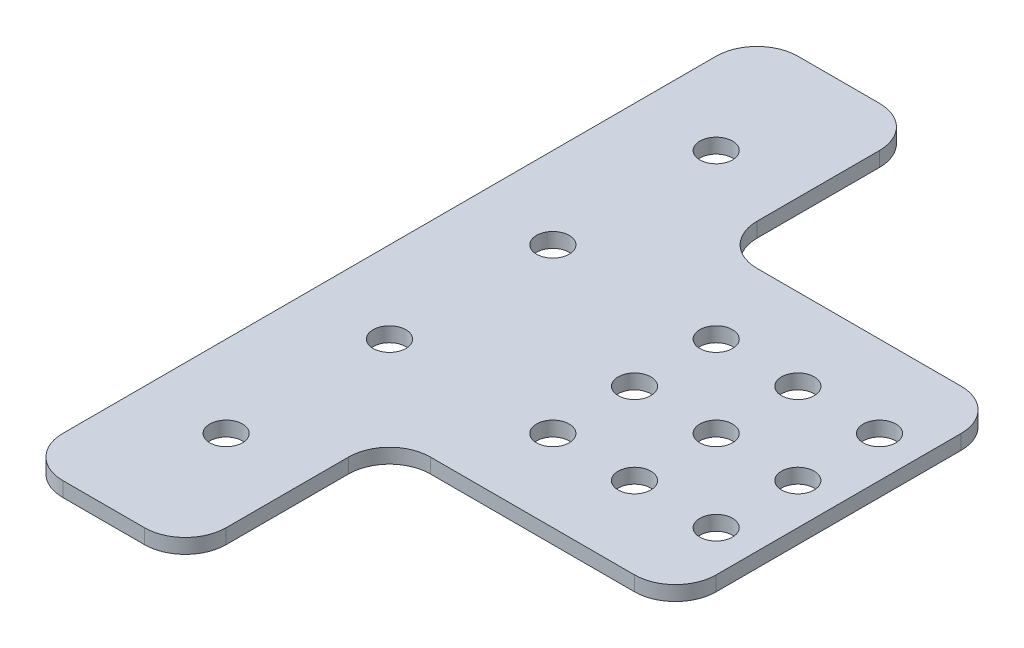
ISO-10303-21;
HEADER;
FILE_DESCRIPTION(('STEP AP214'),'2;1');
FILE_NAME('part.step','',(''),(''),'','','');
FILE_SCHEMA(('AUTOMOTIVE_DESIGN { 1 0 10303 214 1 1 1 1 }'));
ENDSEC;
DATA;
#1=APPLICATION_CONTEXT('core data for automotive mechanical design processes');
#2=APPLICATION_PROTOCOL_DEFINITION('international standard','automotive_design',2000,#1);
#3=PRODUCT_CONTEXT('',#1,'mechanical');
#4=PRODUCT('Part','Part','',(#3));
#5=PRODUCT_RELATED_PRODUCT_CATEGORY('part','',(#4));
#6=PRODUCT_DEFINITION_FORMATION('','',#4);
#7=PRODUCT_DEFINITION_CONTEXT('part definition',#1,'design');
#8=PRODUCT_DEFINITION('design','',#6,#7);
#9=PRODUCT_DEFINITION_SHAPE('','',#8);
#10=(LENGTH_UNIT() NAMED_UNIT(*) SI_UNIT(.MILLI.,.METRE.));
#11=(NAMED_UNIT(*) PLANE_ANGLE_UNIT() SI_UNIT($,.RADIAN.));
#12=(NAMED_UNIT(*) SI_UNIT($,.STERADIAN.) SOLID_ANGLE_UNIT());
#13=UNCERTAINTY_MEASURE_WITH_UNIT(LENGTH_MEASURE(1.E-05),#10,'distance_accuracy_value','');
#14=(GEOMETRIC_REPRESENTATION_CONTEXT(3) GLOBAL_UNCERTAINTY_ASSIGNED_CONTEXT((#13)) GLOBAL_UNIT_ASSIGNED_CONTEXT((#10,
#11,#12)) REPRESENTATION_CONTEXT('',''));
#15=CARTESIAN_POINT('',(0.,0.,0.));
#16=DIRECTION('',(0.,0.,1.));
#17=DIRECTION('',(1.,0.,0.));
#18=AXIS2_PLACEMENT_3D('',#15,#16,#17);
#19=CARTESIAN_POINT('',(0.,2.286,0.));
#20=DIRECTION('',(0.,1.,0.));
#21=DIRECTION('',(0.,0.,1.));
#22=AXIS2_PLACEMENT_3D('',#19,#20,#21);
#23=PLANE('',#22);
#24=CARTESIAN_POINT('',(38.1000000000001,2.286,-57.15));
#25=DIRECTION('',(0.,1.,0.));
#26=DIRECTION('',(0.,0.,1.));
#27=AXIS2_PLACEMENT_3D('',#24,#25,#26);
#28=CIRCLE('',#27,2.53999999999999);
#29=CARTESIAN_POINT('',(38.1000000000001,2.286,-54.61));
#30=VERTEX_POINT('',#29);
#31=EDGE_CURVE('E349',#30,#30,#28,.T.);
#32=ORIENTED_EDGE('',*,*,#31,.F.);
#33=EDGE_LOOP('',(#32));
#34=FACE_BOUND('',#33,.T.);
#35=CARTESIAN_POINT('',(50.8000000000002,2.286,-44.45));
#36=DIRECTION('',(0.,1.,0.));
#37=DIRECTION('',(0.,0.,1.));
#38=AXIS2_PLACEMENT_3D('',#35,#36,#37);
#39=CIRCLE('',#38,2.54);
#40=CARTESIAN_POINT('',(50.8000000000002,2.286,-41.91));
#41=VERTEX_POINT('',#40);
#42=EDGE_CURVE('E337',#41,#41,#39,.T.);
#43=ORIENTED_EDGE('',*,*,#42,.F.);
#44=EDGE_LOOP('',(#43));
#45=FACE_BOUND('',#44,.T.);
#46=CARTESIAN_POINT('',(50.8000000000001,2.286,-57.15));
#47=DIRECTION('',(0.,1.,0.));
#48=DIRECTION('',(0.,0.,1.));
#49=AXIS2_PLACEMENT_3D('',#46,#47,#48);
#50=CIRCLE('',#49,2.53999999999999);
#51=CARTESIAN_POINT('',(50.8000000000001,2.286,-54.61));
#52=VERTEX_POINT('',#51);
#53=EDGE_CURVE('E325',#52,#52,#50,.T.);
#54=ORIENTED_EDGE('',*,*,#53,.F.);
#55=EDGE_LOOP('',(#54));
#56=FACE_BOUND('',#55,.T.);
#57=CARTESIAN_POINT('',(50.8,2.286,-69.85));
#58=DIRECTION('',(0.,1.,0.));
#59=DIRECTION('',(0.,0.,1.));
#60=AXIS2_PLACEMENT_3D('',#57,#58,#59);
#61=CIRCLE('',#60,2.53999999999999);
#62=CARTESIAN_POINT('',(50.8,2.286,-67.31));
#63=VERTEX_POINT('',#62);
#64=EDGE_CURVE('E313',#63,#63,#61,.T.);
#65=ORIENTED_EDGE('',*,*,#64,.F.);
#66=EDGE_LOOP('',(#65));
#67=FACE_BOUND('',#66,.T.);
#68=CARTESIAN_POINT('',(12.7,2.286,-44.45));
#69=DIRECTION('',(0.,1.,0.));
#70=DIRECTION('',(0.,0.,1.));
#71=AXIS2_PLACEMENT_3D('',#68,#69,#70);
#72=CIRCLE('',#71,2.54);
#73=CARTESIAN_POINT('',(12.7,2.286,-41.91));
#74=VERTEX_POINT('',#73);
#75=EDGE_CURVE('E301',#74,#74,#72,.T.);
#76=ORIENTED_EDGE('',*,*,#75,.F.);
#77=EDGE_LOOP('',(#76));
#78=FACE_BOUND('',#77,.T.);
#79=CARTESIAN_POINT('',(38.1,2.286,-69.85));
#80=DIRECTION('',(0.,1.,0.));
#81=DIRECTION('',(0.,0.,1.));
#82=AXIS2_PLACEMENT_3D('',#79,#80,#81);
#83=CIRCLE('',#82,2.53999999999999);
#84=CARTESIAN_POINT('',(38.1,2.286,-67.31));
#85=VERTEX_POINT('',#84);
#86=EDGE_CURVE('E290',#85,#85,#83,.T.);
#87=ORIENTED_EDGE('',*,*,#86,.F.);
#88=EDGE_LOOP('',(#87));
#89=FACE_BOUND('',#88,.T.);
#90=DIRECTION('',(0.,0.,-1.));
#91=VECTOR('',#90,1.);
#92=CARTESIAN_POINT('',(69.85,2.286,-31.75));
#93=LINE('',#92,#91);
#94=CARTESIAN_POINT('',(69.85,2.286,-38.1));
#95=VERTEX_POINT('',#94);
#96=CARTESIAN_POINT('',(69.85,2.286,-76.2));
#97=VERTEX_POINT('',#96);
#98=EDGE_CURVE('E273',#95,#97,#93,.T.);
#99=ORIENTED_EDGE('',*,*,#98,.T.);
#100=CARTESIAN_POINT('',(63.5,2.286,-76.2));
#101=DIRECTION('',(0.,1.,0.));
#102=DIRECTION('',(0.,0.,1.));
#103=AXIS2_PLACEMENT_3D('',#100,#101,#102);
#104=CIRCLE('',#103,6.35);
#105=CARTESIAN_POINT('',(63.5,2.286,-82.55));
#106=VERTEX_POINT('',#105);
#107=EDGE_CURVE('E235',#97,#106,#104,.T.);
#108=ORIENTED_EDGE('',*,*,#107,.T.);
#109=DIRECTION('',(-1.,0.,0.));
#110=VECTOR('',#109,1.);
#111=CARTESIAN_POINT('',(69.85,2.286,-82.55));
#112=LINE('',#111,#110);
#113=CARTESIAN_POINT('',(31.75,2.286,-82.55));
#114=VERTEX_POINT('',#113);
#115=EDGE_CURVE('E187',#106,#114,#112,.T.);
#116=ORIENTED_EDGE('',*,*,#115,.T.);
#117=CARTESIAN_POINT('',(31.75,2.286,-88.9));
#118=DIRECTION('',(0.,1.,0.));
#119=DIRECTION('',(0.,0.,1.));
#120=AXIS2_PLACEMENT_3D('',#117,#118,#119);
#121=CIRCLE('',#120,6.35);
#122=CARTESIAN_POINT('',(25.4,2.286,-88.9));
#123=VERTEX_POINT('',#122);
#124=EDGE_CURVE('E159',#114,#123,#121,.F.);
#125=ORIENTED_EDGE('',*,*,#124,.T.);
#126=DIRECTION('',(0.,0.,-1.));
#127=VECTOR('',#126,1.);
#128=CARTESIAN_POINT('',(25.4,2.286,-82.55));
#129=LINE('',#128,#127);
#130=CARTESIAN_POINT('',(25.4,2.286,-107.95));
#131=VERTEX_POINT('',#130);
#132=EDGE_CURVE('E169',#123,#131,#129,.T.);
#133=ORIENTED_EDGE('',*,*,#132,.T.);
#134=CARTESIAN_POINT('',(19.05,2.286,-107.95));
#135=DIRECTION('',(0.,1.,0.));
#136=DIRECTION('',(0.,0.,1.));
#137=AXIS2_PLACEMENT_3D('',#134,#135,#136);
#138=CIRCLE('',#137,6.35);
#139=CARTESIAN_POINT('',(19.05,2.286,-114.3));
#140=VERTEX_POINT('',#139);
#141=EDGE_CURVE('E227',#131,#140,#138,.T.);
#142=ORIENTED_EDGE('',*,*,#141,.T.);
#143=DIRECTION('',(-1.,0.,0.));
#144=VECTOR('',#143,1.);
#145=CARTESIAN_POINT('',(25.4,2.286,-114.3));
#146=LINE('',#145,#144);
#147=CARTESIAN_POINT('',(6.34999999999999,2.286,-114.3));
#148=VERTEX_POINT('',#147);
#149=EDGE_CURVE('E285',#140,#148,#146,.T.);
#150=ORIENTED_EDGE('',*,*,#149,.T.);
#151=CARTESIAN_POINT('',(6.34999999999999,2.286,-107.95));
#152=DIRECTION('',(0.,1.,0.));
#153=DIRECTION('',(0.,0.,1.));
#154=AXIS2_PLACEMENT_3D('',#151,#152,#153);
#155=CIRCLE('',#154,6.35);
#156=CARTESIAN_POINT('',(0.,2.286,-107.95));
#157=VERTEX_POINT('',#156);
#158=EDGE_CURVE('E229',#148,#157,#155,.T.);
#159=ORIENTED_EDGE('',*,*,#158,.T.);
#160=DIRECTION('',(0.,0.,1.));
#161=VECTOR('',#160,1.);
#162=CARTESIAN_POINT('',(0.,2.286,-114.3));
#163=LINE('',#162,#161);
#164=CARTESIAN_POINT('',(0.,2.286,-6.34999999999999));
#165=VERTEX_POINT('',#164);
#166=EDGE_CURVE('E282',#157,#165,#163,.T.);
#167=ORIENTED_EDGE('',*,*,#166,.T.);
#168=CARTESIAN_POINT('',(6.35,2.286,-6.35));
#169=DIRECTION('',(0.,1.,0.));
#170=DIRECTION('',(0.,0.,1.));
#171=AXIS2_PLACEMENT_3D('',#168,#169,#170);
#172=CIRCLE('',#171,6.35);
#173=CARTESIAN_POINT('',(6.35,2.286,0.));
#174=VERTEX_POINT('',#173);
#175=EDGE_CURVE('E225',#165,#174,#172,.T.);
#176=ORIENTED_EDGE('',*,*,#175,.T.);
#177=DIRECTION('',(1.,0.,0.));
#178=VECTOR('',#177,1.);
#179=CARTESIAN_POINT('',(0.,2.286,0.));
#180=LINE('',#179,#178);
#181=CARTESIAN_POINT('',(19.05,2.286,0.));
#182=VERTEX_POINT('',#181);
#183=EDGE_CURVE('E277',#174,#182,#180,.T.);
#184=ORIENTED_EDGE('',*,*,#183,.T.);
#185=CARTESIAN_POINT('',(19.05,2.286,-6.35));
#186=DIRECTION('',(0.,1.,0.));
#187=DIRECTION('',(0.,0.,1.));
#188=AXIS2_PLACEMENT_3D('',#185,#186,#187);
#189=CIRCLE('',#188,6.35);
#190=CARTESIAN_POINT('',(25.4,2.286,-6.35));
#191=VERTEX_POINT('',#190);
#192=EDGE_CURVE('E231',#182,#191,#189,.T.);
#193=ORIENTED_EDGE('',*,*,#192,.T.);
#194=DIRECTION('',(0.,0.,-1.));
#195=VECTOR('',#194,1.);
#196=CARTESIAN_POINT('',(25.4,2.286,0.));
#197=LINE('',#196,#195);
#198=CARTESIAN_POINT('',(25.4,2.286,-25.4));
#199=VERTEX_POINT('',#198);
#200=EDGE_CURVE('E274',#191,#199,#197,.T.);
#201=ORIENTED_EDGE('',*,*,#200,.T.);
#202=CARTESIAN_POINT('',(31.75,2.286,-25.4));
#203=DIRECTION('',(0.,1.,0.));
#204=DIRECTION('',(0.,0.,1.));
#205=AXIS2_PLACEMENT_3D('',#202,#203,#204);
#206=CIRCLE('',#205,6.35);
#207=CARTESIAN_POINT('',(31.75,2.286,-31.75));
#208=VERTEX_POINT('',#207);
#209=EDGE_CURVE('E11',#199,#208,#206,.F.);
#210=ORIENTED_EDGE('',*,*,#209,.T.);
#211=DIRECTION('',(1.,0.,0.));
#212=VECTOR('',#211,1.);
#213=CARTESIAN_POINT('',(25.4,2.286,-31.75));
#214=LINE('',#213,#212);
#215=CARTESIAN_POINT('',(63.5,2.286,-31.75));
#216=VERTEX_POINT('',#215);
#217=EDGE_CURVE('E271',#208,#216,#214,.T.);
#218=ORIENTED_EDGE('',*,*,#217,.T.);
#219=CARTESIAN_POINT('',(63.5,2.286,-38.1));
#220=DIRECTION('',(0.,1.,0.));
#221=DIRECTION('',(0.,0.,1.));
#222=AXIS2_PLACEMENT_3D('',#219,#220,#221);
#223=CIRCLE('',#222,6.35);
#224=EDGE_CURVE('E233',#216,#95,#223,.T.);
#225=ORIENTED_EDGE('',*,*,#224,.T.);
#226=EDGE_LOOP('',(#99,#108,#116,#125,#133,#142,#150,#159,#167,#176,#184,#193,#201,#210,#218,#225));
#227=FACE_BOUND('',#226,.T.);
#228=CARTESIAN_POINT('',(12.7,2.286,-95.25));
#229=DIRECTION('',(0.,1.,0.));
#230=DIRECTION('',(0.,0.,1.));
#231=AXIS2_PLACEMENT_3D('',#228,#229,#230);
#232=CIRCLE('',#231,2.53999999999999);
#233=CARTESIAN_POINT('',(12.7,2.286,-92.71));
#234=VERTEX_POINT('',#233);
#235=EDGE_CURVE('E178',#234,#234,#232,.T.);
#236=ORIENTED_EDGE('',*,*,#235,.F.);
#237=EDGE_LOOP('',(#236));
#238=FACE_BOUND('',#237,.T.);
#239=CARTESIAN_POINT('',(12.7,2.286,-69.85));
#240=DIRECTION('',(0.,1.,0.));
#241=DIRECTION('',(0.,0.,1.));
#242=AXIS2_PLACEMENT_3D('',#239,#240,#241);
#243=CIRCLE('',#242,2.53999999999999);
#244=CARTESIAN_POINT('',(12.7,2.286,-67.31));
#245=VERTEX_POINT('',#244);
#246=EDGE_CURVE('E295',#245,#245,#243,.T.);
#247=ORIENTED_EDGE('',*,*,#246,.F.);
#248=EDGE_LOOP('',(#247));
#249=FACE_BOUND('',#248,.T.);
#250=CARTESIAN_POINT('',(12.7,2.286,-19.05));
#251=DIRECTION('',(0.,1.,0.));
#252=DIRECTION('',(0.,0.,1.));
#253=AXIS2_PLACEMENT_3D('',#250,#251,#252);
#254=CIRCLE('',#253,2.53999999999999);
#255=CARTESIAN_POINT('',(12.7,2.286,-16.51));
#256=VERTEX_POINT('',#255);
#257=EDGE_CURVE('E307',#256,#256,#254,.T.);
#258=ORIENTED_EDGE('',*,*,#257,.F.);
#259=EDGE_LOOP('',(#258));
#260=FACE_BOUND('',#259,.T.);
#261=CARTESIAN_POINT('',(63.5,2.286,-69.85));
#262=DIRECTION('',(0.,1.,0.));
#263=DIRECTION('',(0.,0.,1.));
#264=AXIS2_PLACEMENT_3D('',#261,#262,#263);
#265=CIRCLE('',#264,2.54000000000001);
#266=CARTESIAN_POINT('',(63.5,2.286,-67.31));
#267=VERTEX_POINT('',#266);
#268=EDGE_CURVE('E319',#267,#267,#265,.T.);
#269=ORIENTED_EDGE('',*,*,#268,.F.);
#270=EDGE_LOOP('',(#269));
#271=FACE_BOUND('',#270,.T.);
#272=CARTESIAN_POINT('',(63.5000000000001,2.286,-57.15));
#273=DIRECTION('',(0.,1.,0.));
#274=DIRECTION('',(0.,0.,1.));
#275=AXIS2_PLACEMENT_3D('',#272,#273,#274);
#276=CIRCLE('',#275,2.53999999999999);
#277=CARTESIAN_POINT('',(63.5000000000001,2.286,-54.61));
#278=VERTEX_POINT('',#277);
#279=EDGE_CURVE('E331',#278,#278,#276,.T.);
#280=ORIENTED_EDGE('',*,*,#279,.F.);
#281=EDGE_LOOP('',(#280));
#282=FACE_BOUND('',#281,.T.);
#283=CARTESIAN_POINT('',(63.5000000000002,2.286,-44.45));
#284=DIRECTION('',(0.,1.,0.));
#285=DIRECTION('',(0.,0.,1.));
#286=AXIS2_PLACEMENT_3D('',#283,#284,#285);
#287=CIRCLE('',#286,2.53999999999998);
#288=CARTESIAN_POINT('',(63.5000000000002,2.286,-41.91));
#289=VERTEX_POINT('',#288);
#290=EDGE_CURVE('E343',#289,#289,#287,.T.);
#291=ORIENTED_EDGE('',*,*,#290,.F.);
#292=EDGE_LOOP('',(#291));
#293=FACE_BOUND('',#292,.T.);
#294=CARTESIAN_POINT('',(38.1000000000002,2.286,-44.45));
#295=DIRECTION('',(0.,1.,0.));
#296=DIRECTION('',(0.,0.,1.));
#297=AXIS2_PLACEMENT_3D('',#294,#295,#296);
#298=CIRCLE('',#297,2.54);
#299=CARTESIAN_POINT('',(38.1000000000002,2.286,-41.91));
#300=VERTEX_POINT('',#299);
#301=EDGE_CURVE('E355',#300,#300,#298,.T.);
#302=ORIENTED_EDGE('',*,*,#301,.F.);
#303=EDGE_LOOP('',(#302));
#304=FACE_BOUND('',#303,.T.);
#305=ADVANCED_FACE('F36',(#34,#45,#56,#67,#78,#89,#227,#238,#249,#260,#271,#282,#293,#304),#23,.T.);
#306=CARTESIAN_POINT('',(0.,0.,0.));
#307=DIRECTION('',(0.,1.,0.));
#308=DIRECTION('',(0.,0.,1.));
#309=AXIS2_PLACEMENT_3D('',#306,#307,#308);
#310=PLANE('',#309);
#311=DIRECTION('',(-1.,0.,0.));
#312=VECTOR('',#311,1.);
#313=CARTESIAN_POINT('',(69.85,0.,-82.55));
#314=LINE('',#313,#312);
#315=CARTESIAN_POINT('',(63.5,0.,-82.55));
#316=VERTEX_POINT('',#315);
#317=CARTESIAN_POINT('',(31.75,0.,-82.55));
#318=VERTEX_POINT('',#317);
#319=EDGE_CURVE('E203',#316,#318,#314,.T.);
#320=ORIENTED_EDGE('',*,*,#319,.F.);
#321=CARTESIAN_POINT('',(63.5,0.,-76.2));
#322=DIRECTION('',(0.,1.,0.));
#323=DIRECTION('',(0.,0.,1.));
#324=AXIS2_PLACEMENT_3D('',#321,#322,#323);
#325=CIRCLE('',#324,6.35);
#326=CARTESIAN_POINT('',(69.85,0.,-76.2));
#327=VERTEX_POINT('',#326);
#328=EDGE_CURVE('E218',#316,#327,#325,.F.);
#329=ORIENTED_EDGE('',*,*,#328,.T.);
#330=DIRECTION('',(0.,0.,-1.));
#331=VECTOR('',#330,1.);
#332=CARTESIAN_POINT('',(69.85,0.,-31.75));
#333=LINE('',#332,#331);
#334=CARTESIAN_POINT('',(69.85,0.,-38.1));
#335=VERTEX_POINT('',#334);
#336=EDGE_CURVE('E200',#335,#327,#333,.T.);
#337=ORIENTED_EDGE('',*,*,#336,.F.);
#338=CARTESIAN_POINT('',(63.5,0.,-38.1));
#339=DIRECTION('',(0.,1.,0.));
#340=DIRECTION('',(0.,0.,1.));
#341=AXIS2_PLACEMENT_3D('',#338,#339,#340);
#342=CIRCLE('',#341,6.35);
#343=CARTESIAN_POINT('',(63.5,0.,-31.75));
#344=VERTEX_POINT('',#343);
#345=EDGE_CURVE('E216',#335,#344,#342,.F.);
#346=ORIENTED_EDGE('',*,*,#345,.T.);
#347=DIRECTION('',(1.,0.,0.));
#348=VECTOR('',#347,1.);
#349=CARTESIAN_POINT('',(25.4,0.,-31.75));
#350=LINE('',#349,#348);
#351=CARTESIAN_POINT('',(31.75,0.,-31.75));
#352=VERTEX_POINT('',#351);
#353=EDGE_CURVE('E198',#352,#344,#350,.T.);
#354=ORIENTED_EDGE('',*,*,#353,.F.);
#355=CARTESIAN_POINT('',(31.75,0.,-25.4));
#356=DIRECTION('',(0.,1.,0.));
#357=DIRECTION('',(0.,0.,1.));
#358=AXIS2_PLACEMENT_3D('',#355,#356,#357);
#359=CIRCLE('',#358,6.35);
#360=CARTESIAN_POINT('',(25.4,0.,-25.4));
#361=VERTEX_POINT('',#360);
#362=EDGE_CURVE('E44',#352,#361,#359,.T.);
#363=ORIENTED_EDGE('',*,*,#362,.T.);
#364=DIRECTION('',(0.,0.,-1.));
#365=VECTOR('',#364,1.);
#366=CARTESIAN_POINT('',(25.4,0.,0.));
#367=LINE('',#366,#365);
#368=CARTESIAN_POINT('',(25.4,0.,-6.35));
#369=VERTEX_POINT('',#368);
#370=EDGE_CURVE('E195',#369,#361,#367,.T.);
#371=ORIENTED_EDGE('',*,*,#370,.F.);
#372=CARTESIAN_POINT('',(19.05,0.,-6.35));
#373=DIRECTION('',(0.,1.,0.));
#374=DIRECTION('',(0.,0.,1.));
#375=AXIS2_PLACEMENT_3D('',#372,#373,#374);
#376=CIRCLE('',#375,6.35);
#377=CARTESIAN_POINT('',(19.05,0.,0.));
#378=VERTEX_POINT('',#377);
#379=EDGE_CURVE('E214',#369,#378,#376,.F.);
#380=ORIENTED_EDGE('',*,*,#379,.T.);
#381=DIRECTION('',(1.,0.,0.));
#382=VECTOR('',#381,1.);
#383=CARTESIAN_POINT('',(0.,0.,0.));
#384=LINE('',#383,#382);
#385=CARTESIAN_POINT('',(6.35,0.,0.));
#386=VERTEX_POINT('',#385);
#387=EDGE_CURVE('E192',#386,#378,#384,.T.);
#388=ORIENTED_EDGE('',*,*,#387,.F.);
#389=CARTESIAN_POINT('',(6.35,0.,-6.35));
#390=DIRECTION('',(0.,1.,0.));
#391=DIRECTION('',(0.,0.,1.));
#392=AXIS2_PLACEMENT_3D('',#389,#390,#391);
#393=CIRCLE('',#392,6.35);
#394=CARTESIAN_POINT('',(0.,0.,-6.34999999999999));
#395=VERTEX_POINT('',#394);
#396=EDGE_CURVE('E209',#386,#395,#393,.F.);
#397=ORIENTED_EDGE('',*,*,#396,.T.);
#398=DIRECTION('',(0.,0.,1.));
#399=VECTOR('',#398,1.);
#400=CARTESIAN_POINT('',(0.,0.,-114.3));
#401=LINE('',#400,#399);
#402=CARTESIAN_POINT('',(0.,0.,-107.95));
#403=VERTEX_POINT('',#402);
#404=EDGE_CURVE('E181',#403,#395,#401,.T.);
#405=ORIENTED_EDGE('',*,*,#404,.F.);
#406=CARTESIAN_POINT('',(6.34999999999999,0.,-107.95));
#407=DIRECTION('',(0.,1.,0.));
#408=DIRECTION('',(0.,0.,1.));
#409=AXIS2_PLACEMENT_3D('',#406,#407,#408);
#410=CIRCLE('',#409,6.35);
#411=CARTESIAN_POINT('',(6.34999999999999,0.,-114.3));
#412=VERTEX_POINT('',#411);
#413=EDGE_CURVE('E212',#403,#412,#410,.F.);
#414=ORIENTED_EDGE('',*,*,#413,.T.);
#415=DIRECTION('',(-1.,0.,0.));
#416=VECTOR('',#415,1.);
#417=CARTESIAN_POINT('',(25.4,0.,-114.3));
#418=LINE('',#417,#416);
#419=CARTESIAN_POINT('',(19.05,0.,-114.3));
#420=VERTEX_POINT('',#419);
#421=EDGE_CURVE('E177',#420,#412,#418,.T.);
#422=ORIENTED_EDGE('',*,*,#421,.F.);
#423=CARTESIAN_POINT('',(19.05,0.,-107.95));
#424=DIRECTION('',(0.,1.,0.));
#425=DIRECTION('',(0.,0.,1.));
#426=AXIS2_PLACEMENT_3D('',#423,#424,#425);
#427=CIRCLE('',#426,6.35);
#428=CARTESIAN_POINT('',(25.4,0.,-107.95));
#429=VERTEX_POINT('',#428);
#430=EDGE_CURVE('E176',#420,#429,#427,.F.);
#431=ORIENTED_EDGE('',*,*,#430,.T.);
#432=DIRECTION('',(0.,0.,-1.));
#433=VECTOR('',#432,1.);
#434=CARTESIAN_POINT('',(25.4,0.,-82.55));
#435=LINE('',#434,#433);
#436=CARTESIAN_POINT('',(25.4,0.,-88.9));
#437=VERTEX_POINT('',#436);
#438=EDGE_CURVE('E166',#437,#429,#435,.T.);
#439=ORIENTED_EDGE('',*,*,#438,.F.);
#440=CARTESIAN_POINT('',(31.75,0.,-88.9));
#441=DIRECTION('',(0.,1.,0.));
#442=DIRECTION('',(0.,0.,1.));
#443=AXIS2_PLACEMENT_3D('',#440,#441,#442);
#444=CIRCLE('',#443,6.35);
#445=EDGE_CURVE('E149',#437,#318,#444,.T.);
#446=ORIENTED_EDGE('',*,*,#445,.T.);
#447=EDGE_LOOP('',(#320,#329,#337,#346,#354,#363,#371,#380,#388,#397,#405,#414,#422,#431,#439,#446));
#448=FACE_BOUND('',#447,.T.);
#449=CARTESIAN_POINT('',(12.7,0.,-95.25));
#450=DIRECTION('',(0.,1.,0.));
#451=DIRECTION('',(0.,0.,1.));
#452=AXIS2_PLACEMENT_3D('',#449,#450,#451);
#453=CIRCLE('',#452,2.53999999999999);
#454=CARTESIAN_POINT('',(12.7,0.,-92.71));
#455=VERTEX_POINT('',#454);
#456=EDGE_CURVE('E184',#455,#455,#453,.T.);
#457=ORIENTED_EDGE('',*,*,#456,.T.);
#458=EDGE_LOOP('',(#457));
#459=FACE_BOUND('',#458,.T.);
#460=CARTESIAN_POINT('',(38.1,0.,-69.85));
#461=DIRECTION('',(0.,1.,0.));
#462=DIRECTION('',(0.,0.,1.));
#463=AXIS2_PLACEMENT_3D('',#460,#461,#462);
#464=CIRCLE('',#463,2.53999999999999);
#465=CARTESIAN_POINT('',(38.1,0.,-67.31));
#466=VERTEX_POINT('',#465);
#467=EDGE_CURVE('E292',#466,#466,#464,.T.);
#468=ORIENTED_EDGE('',*,*,#467,.T.);
#469=EDGE_LOOP('',(#468));
#470=FACE_BOUND('',#469,.T.);
#471=CARTESIAN_POINT('',(12.7,0.,-69.85));
#472=DIRECTION('',(0.,1.,0.));
#473=DIRECTION('',(0.,0.,1.));
#474=AXIS2_PLACEMENT_3D('',#471,#472,#473);
#475=CIRCLE('',#474,2.53999999999999);
#476=CARTESIAN_POINT('',(12.7,0.,-67.31));
#477=VERTEX_POINT('',#476);
#478=EDGE_CURVE('E298',#477,#477,#475,.T.);
#479=ORIENTED_EDGE('',*,*,#478,.T.);
#480=EDGE_LOOP('',(#479));
#481=FACE_BOUND('',#480,.T.);
#482=CARTESIAN_POINT('',(12.7,0.,-44.45));
#483=DIRECTION('',(0.,1.,0.));
#484=DIRECTION('',(0.,0.,1.));
#485=AXIS2_PLACEMENT_3D('',#482,#483,#484);
#486=CIRCLE('',#485,2.54);
#487=CARTESIAN_POINT('',(12.7,0.,-41.91));
#488=VERTEX_POINT('',#487);
#489=EDGE_CURVE('E304',#488,#488,#486,.T.);
#490=ORIENTED_EDGE('',*,*,#489,.T.);
#491=EDGE_LOOP('',(#490));
#492=FACE_BOUND('',#491,.T.);
#493=CARTESIAN_POINT('',(12.7,0.,-19.05));
#494=DIRECTION('',(0.,1.,0.));
#495=DIRECTION('',(0.,0.,1.));
#496=AXIS2_PLACEMENT_3D('',#493,#494,#495);
#497=CIRCLE('',#496,2.53999999999999);
#498=CARTESIAN_POINT('',(12.7,0.,-16.51));
#499=VERTEX_POINT('',#498);
#500=EDGE_CURVE('E310',#499,#499,#497,.T.);
#501=ORIENTED_EDGE('',*,*,#500,.T.);
#502=EDGE_LOOP('',(#501));
#503=FACE_BOUND('',#502,.T.);
#504=CARTESIAN_POINT('',(50.8,0.,-69.85));
#505=DIRECTION('',(0.,1.,0.));
#506=DIRECTION('',(0.,0.,1.));
#507=AXIS2_PLACEMENT_3D('',#504,#505,#506);
#508=CIRCLE('',#507,2.53999999999999);
#509=CARTESIAN_POINT('',(50.8,0.,-67.31));
#510=VERTEX_POINT('',#509);
#511=EDGE_CURVE('E316',#510,#510,#508,.T.);
#512=ORIENTED_EDGE('',*,*,#511,.T.);
#513=EDGE_LOOP('',(#512));
#514=FACE_BOUND('',#513,.T.);
#515=CARTESIAN_POINT('',(63.5,0.,-69.85));
#516=DIRECTION('',(0.,1.,0.));
#517=DIRECTION('',(0.,0.,1.));
#518=AXIS2_PLACEMENT_3D('',#515,#516,#517);
#519=CIRCLE('',#518,2.54000000000001);
#520=CARTESIAN_POINT('',(63.5,0.,-67.31));
#521=VERTEX_POINT('',#520);
#522=EDGE_CURVE('E322',#521,#521,#519,.T.);
#523=ORIENTED_EDGE('',*,*,#522,.T.);
#524=EDGE_LOOP('',(#523));
#525=FACE_BOUND('',#524,.T.);
#526=CARTESIAN_POINT('',(50.8000000000001,0.,-57.15));
#527=DIRECTION('',(0.,1.,0.));
#528=DIRECTION('',(0.,0.,1.));
#529=AXIS2_PLACEMENT_3D('',#526,#527,#528);
#530=CIRCLE('',#529,2.53999999999999);
#531=CARTESIAN_POINT('',(50.8000000000001,0.,-54.61));
#532=VERTEX_POINT('',#531);
#533=EDGE_CURVE('E328',#532,#532,#530,.T.);
#534=ORIENTED_EDGE('',*,*,#533,.T.);
#535=EDGE_LOOP('',(#534));
#536=FACE_BOUND('',#535,.T.);
#537=CARTESIAN_POINT('',(63.5000000000001,0.,-57.15));
#538=DIRECTION('',(0.,1.,0.));
#539=DIRECTION('',(0.,0.,1.));
#540=AXIS2_PLACEMENT_3D('',#537,#538,#539);
#541=CIRCLE('',#540,2.53999999999999);
#542=CARTESIAN_POINT('',(63.5000000000001,0.,-54.61));
#543=VERTEX_POINT('',#542);
#544=EDGE_CURVE('E334',#543,#543,#541,.T.);
#545=ORIENTED_EDGE('',*,*,#544,.T.);
#546=EDGE_LOOP('',(#545));
#547=FACE_BOUND('',#546,.T.);
#548=CARTESIAN_POINT('',(50.8000000000002,0.,-44.45));
#549=DIRECTION('',(0.,1.,0.));
#550=DIRECTION('',(0.,0.,1.));
#551=AXIS2_PLACEMENT_3D('',#548,#549,#550);
#552=CIRCLE('',#551,2.54);
#553=CARTESIAN_POINT('',(50.8000000000002,0.,-41.91));
#554=VERTEX_POINT('',#553);
#555=EDGE_CURVE('E340',#554,#554,#552,.T.);
#556=ORIENTED_EDGE('',*,*,#555,.T.);
#557=EDGE_LOOP('',(#556));
#558=FACE_BOUND('',#557,.T.);
#559=CARTESIAN_POINT('',(63.5000000000002,0.,-44.45));
#560=DIRECTION('',(0.,1.,0.));
#561=DIRECTION('',(0.,0.,1.));
#562=AXIS2_PLACEMENT_3D('',#559,#560,#561);
#563=CIRCLE('',#562,2.53999999999998);
#564=CARTESIAN_POINT('',(63.5000000000002,0.,-41.91));
#565=VERTEX_POINT('',#564);
#566=EDGE_CURVE('E346',#565,#565,#563,.T.);
#567=ORIENTED_EDGE('',*,*,#566,.T.);
#568=EDGE_LOOP('',(#567));
#569=FACE_BOUND('',#568,.T.);
#570=CARTESIAN_POINT('',(38.1000000000001,0.,-57.15));
#571=DIRECTION('',(0.,1.,0.));
#572=DIRECTION('',(0.,0.,1.));
#573=AXIS2_PLACEMENT_3D('',#570,#571,#572);
#574=CIRCLE('',#573,2.53999999999999);
#575=CARTESIAN_POINT('',(38.1000000000001,0.,-54.61));
#576=VERTEX_POINT('',#575);
#577=EDGE_CURVE('E352',#576,#576,#574,.T.);
#578=ORIENTED_EDGE('',*,*,#577,.T.);
#579=EDGE_LOOP('',(#578));
#580=FACE_BOUND('',#579,.T.);
#581=CARTESIAN_POINT('',(38.1000000000002,0.,-44.45));
#582=DIRECTION('',(0.,1.,0.));
#583=DIRECTION('',(0.,0.,1.));
#584=AXIS2_PLACEMENT_3D('',#581,#582,#583);
#585=CIRCLE('',#584,2.54);
#586=CARTESIAN_POINT('',(38.1000000000002,0.,-41.91));
#587=VERTEX_POINT('',#586);
#588=EDGE_CURVE('E358',#587,#587,#585,.T.);
#589=ORIENTED_EDGE('',*,*,#588,.T.);
#590=EDGE_LOOP('',(#589));
#591=FACE_BOUND('',#590,.T.);
#592=ADVANCED_FACE('F173',(#448,#459,#470,#481,#492,#503,#514,#525,#536,#547,#558,#569,#580,
#591),#310,.F.);
#593=CARTESIAN_POINT('',(25.4,2.286,-82.55));
#594=DIRECTION('',(-1.,0.,0.));
#595=DIRECTION('',(0.,0.,1.));
#596=AXIS2_PLACEMENT_3D('',#593,#594,#595);
#597=PLANE('',#596);
#598=ORIENTED_EDGE('',*,*,#132,.F.);
#599=DIRECTION('',(0.,-1.,0.));
#600=VECTOR('',#599,1.);
#601=CARTESIAN_POINT('',(25.4,0.,-88.9));
#602=LINE('',#601,#600);
#603=EDGE_CURVE('E153',#123,#437,#602,.T.);
#604=ORIENTED_EDGE('',*,*,#603,.T.);
#605=ORIENTED_EDGE('',*,*,#438,.T.);
#606=DIRECTION('',(0.,-1.,0.));
#607=VECTOR('',#606,1.);
#608=CARTESIAN_POINT('',(25.4,2.286,-107.95));
#609=LINE('',#608,#607);
#610=EDGE_CURVE('E171',#429,#131,#609,.F.);
#611=ORIENTED_EDGE('',*,*,#610,.T.);
#612=EDGE_LOOP('',(#598,#604,#605,#611));
#613=FACE_BOUND('',#612,.T.);
#614=ADVANCED_FACE('F165',(#613),#597,.F.);
#615=CARTESIAN_POINT('',(25.4,2.286,-114.3));
#616=DIRECTION('',(0.,0.,1.));
#617=DIRECTION('',(1.,0.,0.));
#618=AXIS2_PLACEMENT_3D('',#615,#616,#617);
#619=PLANE('',#618);
#620=ORIENTED_EDGE('',*,*,#421,.T.);
#621=DIRECTION('',(0.,-1.,0.));
#622=VECTOR('',#621,1.);
#623=CARTESIAN_POINT('',(6.34999999999999,2.286,-114.3));
#624=LINE('',#623,#622);
#625=EDGE_CURVE('E160',#412,#148,#624,.F.);
#626=ORIENTED_EDGE('',*,*,#625,.T.);
#627=ORIENTED_EDGE('',*,*,#149,.F.);
#628=DIRECTION('',(0.,-1.,0.));
#629=VECTOR('',#628,1.);
#630=CARTESIAN_POINT('',(19.05,2.286,-114.3));
#631=LINE('',#630,#629);
#632=EDGE_CURVE('E256',#140,#420,#631,.T.);
#633=ORIENTED_EDGE('',*,*,#632,.T.);
#634=EDGE_LOOP('',(#620,#626,#627,#633));
#635=FACE_BOUND('',#634,.T.);
#636=ADVANCED_FACE('F399',(#635),#619,.F.);
#637=CARTESIAN_POINT('',(0.,2.286,-114.3));
#638=DIRECTION('',(1.,0.,0.));
#639=DIRECTION('',(0.,0.,-1.));
#640=AXIS2_PLACEMENT_3D('',#637,#638,#639);
#641=PLANE('',#640);
#642=ORIENTED_EDGE('',*,*,#166,.F.);
#643=DIRECTION('',(0.,-1.,0.));
#644=VECTOR('',#643,1.);
#645=CARTESIAN_POINT('',(0.,2.286,-107.95));
#646=LINE('',#645,#644);
#647=EDGE_CURVE('E253',#157,#403,#646,.T.);
#648=ORIENTED_EDGE('',*,*,#647,.T.);
#649=ORIENTED_EDGE('',*,*,#404,.T.);
#650=DIRECTION('',(0.,-1.,0.));
#651=VECTOR('',#650,1.);
#652=CARTESIAN_POINT('',(0.,2.286,-6.34999999999999));
#653=LINE('',#652,#651);
#654=EDGE_CURVE('E251',#395,#165,#653,.F.);
#655=ORIENTED_EDGE('',*,*,#654,.T.);
#656=EDGE_LOOP('',(#642,#648,#649,#655));
#657=FACE_BOUND('',#656,.T.);
#658=ADVANCED_FACE('F395',(#657),#641,.F.);
#659=CARTESIAN_POINT('',(0.,2.286,0.));
#660=DIRECTION('',(0.,0.,-1.));
#661=DIRECTION('',(-1.,0.,0.));
#662=AXIS2_PLACEMENT_3D('',#659,#660,#661);
#663=PLANE('',#662);
#664=ORIENTED_EDGE('',*,*,#387,.T.);
#665=DIRECTION('',(0.,-1.,0.));
#666=VECTOR('',#665,1.);
#667=CARTESIAN_POINT('',(19.05,2.286,0.));
#668=LINE('',#667,#666);
#669=EDGE_CURVE('E249',#378,#182,#668,.F.);
#670=ORIENTED_EDGE('',*,*,#669,.T.);
#671=ORIENTED_EDGE('',*,*,#183,.F.);
#672=DIRECTION('',(0.,-1.,0.));
#673=VECTOR('',#672,1.);
#674=CARTESIAN_POINT('',(6.35,2.286,0.));
#675=LINE('',#674,#673);
#676=EDGE_CURVE('E246',#174,#386,#675,.T.);
#677=ORIENTED_EDGE('',*,*,#676,.T.);
#678=EDGE_LOOP('',(#664,#670,#671,#677));
#679=FACE_BOUND('',#678,.T.);
#680=ADVANCED_FACE('F392',(#679),#663,.F.);
#681=CARTESIAN_POINT('',(25.4,2.286,0.));
#682=DIRECTION('',(-1.,0.,0.));
#683=DIRECTION('',(0.,0.,1.));
#684=AXIS2_PLACEMENT_3D('',#681,#682,#683);
#685=PLANE('',#684);
#686=ORIENTED_EDGE('',*,*,#370,.T.);
#687=DIRECTION('',(0.,-1.,0.));
#688=VECTOR('',#687,1.);
#689=CARTESIAN_POINT('',(25.4,2.286,-25.4));
#690=LINE('',#689,#688);
#691=EDGE_CURVE('E244',#361,#199,#690,.F.);
#692=ORIENTED_EDGE('',*,*,#691,.T.);
#693=ORIENTED_EDGE('',*,*,#200,.F.);
#694=DIRECTION('',(0.,-1.,0.));
#695=VECTOR('',#694,1.);
#696=CARTESIAN_POINT('',(25.4,2.286,-6.35));
#697=LINE('',#696,#695);
#698=EDGE_CURVE('E241',#191,#369,#697,.T.);
#699=ORIENTED_EDGE('',*,*,#698,.T.);
#700=EDGE_LOOP('',(#686,#692,#693,#699));
#701=FACE_BOUND('',#700,.T.);
#702=ADVANCED_FACE('F266',(#701),#685,.F.);
#703=CARTESIAN_POINT('',(25.4,2.286,-31.75));
#704=DIRECTION('',(0.,0.,-1.));
#705=DIRECTION('',(-1.,0.,0.));
#706=AXIS2_PLACEMENT_3D('',#703,#704,#705);
#707=PLANE('',#706);
#708=ORIENTED_EDGE('',*,*,#353,.T.);
#709=DIRECTION('',(0.,-1.,0.));
#710=VECTOR('',#709,1.);
#711=CARTESIAN_POINT('',(63.5,2.286,-31.75));
#712=LINE('',#711,#710);
#713=EDGE_CURVE('E51',#344,#216,#712,.F.);
#714=ORIENTED_EDGE('',*,*,#713,.T.);
#715=ORIENTED_EDGE('',*,*,#217,.F.);
#716=DIRECTION('',(0.,-1.,0.));
#717=VECTOR('',#716,1.);
#718=CARTESIAN_POINT('',(31.75,0.,-31.75));
#719=LINE('',#718,#717);
#720=EDGE_CURVE('E237',#208,#352,#719,.T.);
#721=ORIENTED_EDGE('',*,*,#720,.T.);
#722=EDGE_LOOP('',(#708,#714,#715,#721));
#723=FACE_BOUND('',#722,.T.);
#724=ADVANCED_FACE('F270',(#723),#707,.F.);
#725=CARTESIAN_POINT('',(69.85,2.286,-31.75));
#726=DIRECTION('',(-1.,0.,0.));
#727=DIRECTION('',(0.,0.,1.));
#728=AXIS2_PLACEMENT_3D('',#725,#726,#727);
#729=PLANE('',#728);
#730=ORIENTED_EDGE('',*,*,#336,.T.);
#731=DIRECTION('',(0.,-1.,0.));
#732=VECTOR('',#731,1.);
#733=CARTESIAN_POINT('',(69.85,2.286,-76.2));
#734=LINE('',#733,#732);
#735=EDGE_CURVE('E223',#327,#97,#734,.F.);
#736=ORIENTED_EDGE('',*,*,#735,.T.);
#737=ORIENTED_EDGE('',*,*,#98,.F.);
#738=DIRECTION('',(0.,-1.,0.));
#739=VECTOR('',#738,1.);
#740=CARTESIAN_POINT('',(69.85,2.286,-38.1));
#741=LINE('',#740,#739);
#742=EDGE_CURVE('E220',#95,#335,#741,.T.);
#743=ORIENTED_EDGE('',*,*,#742,.T.);
#744=EDGE_LOOP('',(#730,#736,#737,#743));
#745=FACE_BOUND('',#744,.T.);
#746=ADVANCED_FACE('F383',(#745),#729,.F.);
#747=CARTESIAN_POINT('',(69.85,2.286,-82.55));
#748=DIRECTION('',(0.,0.,1.));
#749=DIRECTION('',(1.,0.,0.));
#750=AXIS2_PLACEMENT_3D('',#747,#748,#749);
#751=PLANE('',#750);
#752=ORIENTED_EDGE('',*,*,#319,.T.);
#753=DIRECTION('',(0.,-1.,0.));
#754=VECTOR('',#753,1.);
#755=CARTESIAN_POINT('',(31.75,2.286,-82.55));
#756=LINE('',#755,#754);
#757=EDGE_CURVE('E154',#318,#114,#756,.F.);
#758=ORIENTED_EDGE('',*,*,#757,.T.);
#759=ORIENTED_EDGE('',*,*,#115,.F.);
#760=DIRECTION('',(0.,-1.,0.));
#761=VECTOR('',#760,1.);
#762=CARTESIAN_POINT('',(63.5,2.286,-82.55));
#763=LINE('',#762,#761);
#764=EDGE_CURVE('E170',#106,#316,#763,.T.);
#765=ORIENTED_EDGE('',*,*,#764,.T.);
#766=EDGE_LOOP('',(#752,#758,#759,#765));
#767=FACE_BOUND('',#766,.T.);
#768=ADVANCED_FACE('F380',(#767),#751,.F.);
#769=CARTESIAN_POINT('',(12.7,2.286,-95.25));
#770=DIRECTION('',(0.,-1.,0.));
#771=DIRECTION('',(0.,0.,-1.));
#772=AXIS2_PLACEMENT_3D('',#769,#770,#771);
#773=CYLINDRICAL_SURFACE('',#772,2.53999999999999);
#774=ORIENTED_EDGE('',*,*,#235,.T.);
#775=EDGE_LOOP('',(#774));
#776=FACE_BOUND('',#775,.T.);
#777=ORIENTED_EDGE('',*,*,#456,.F.);
#778=EDGE_LOOP('',(#777));
#779=FACE_BOUND('',#778,.T.);
#780=ADVANCED_FACE('F377',(#776,#779),#773,.F.);
#781=CARTESIAN_POINT('',(38.1,2.286,-69.85));
#782=DIRECTION('',(0.,-1.,0.));
#783=DIRECTION('',(0.,0.,-1.));
#784=AXIS2_PLACEMENT_3D('',#781,#782,#783);
#785=CYLINDRICAL_SURFACE('',#784,2.53999999999999);
#786=ORIENTED_EDGE('',*,*,#86,.T.);
#787=EDGE_LOOP('',(#786));
#788=FACE_BOUND('',#787,.T.);
#789=ORIENTED_EDGE('',*,*,#467,.F.);
#790=EDGE_LOOP('',(#789));
#791=FACE_BOUND('',#790,.T.);
#792=ADVANCED_FACE('F517',(#788,#791),#785,.F.);
#793=CARTESIAN_POINT('',(12.7,2.286,-69.85));
#794=DIRECTION('',(0.,-1.,0.));
#795=DIRECTION('',(0.,0.,-1.));
#796=AXIS2_PLACEMENT_3D('',#793,#794,#795);
#797=CYLINDRICAL_SURFACE('',#796,2.53999999999999);
#798=ORIENTED_EDGE('',*,*,#246,.T.);
#799=EDGE_LOOP('',(#798));
#800=FACE_BOUND('',#799,.T.);
#801=ORIENTED_EDGE('',*,*,#478,.F.);
#802=EDGE_LOOP('',(#801));
#803=FACE_BOUND('',#802,.T.);
#804=ADVANCED_FACE('F514',(#800,#803),#797,.F.);
#805=CARTESIAN_POINT('',(12.7,2.286,-44.45));
#806=DIRECTION('',(0.,-1.,0.));
#807=DIRECTION('',(0.,0.,-1.));
#808=AXIS2_PLACEMENT_3D('',#805,#806,#807);
#809=CYLINDRICAL_SURFACE('',#808,2.54);
#810=ORIENTED_EDGE('',*,*,#75,.T.);
#811=EDGE_LOOP('',(#810));
#812=FACE_BOUND('',#811,.T.);
#813=ORIENTED_EDGE('',*,*,#489,.F.);
#814=EDGE_LOOP('',(#813));
#815=FACE_BOUND('',#814,.T.);
#816=ADVANCED_FACE('F510',(#812,#815),#809,.F.);
#817=CARTESIAN_POINT('',(12.7,2.286,-19.05));
#818=DIRECTION('',(0.,-1.,0.));
#819=DIRECTION('',(0.,0.,-1.));
#820=AXIS2_PLACEMENT_3D('',#817,#818,#819);
#821=CYLINDRICAL_SURFACE('',#820,2.53999999999999);
#822=ORIENTED_EDGE('',*,*,#257,.T.);
#823=EDGE_LOOP('',(#822));
#824=FACE_BOUND('',#823,.T.);
#825=ORIENTED_EDGE('',*,*,#500,.F.);
#826=EDGE_LOOP('',(#825));
#827=FACE_BOUND('',#826,.T.);
#828=ADVANCED_FACE('F506',(#824,#827),#821,.F.);
#829=CARTESIAN_POINT('',(50.8,2.286,-69.85));
#830=DIRECTION('',(0.,-1.,0.));
#831=DIRECTION('',(0.,0.,-1.));
#832=AXIS2_PLACEMENT_3D('',#829,#830,#831);
#833=CYLINDRICAL_SURFACE('',#832,2.53999999999999);
#834=ORIENTED_EDGE('',*,*,#64,.T.);
#835=EDGE_LOOP('',(#834));
#836=FACE_BOUND('',#835,.T.);
#837=ORIENTED_EDGE('',*,*,#511,.F.);
#838=EDGE_LOOP('',(#837));
#839=FACE_BOUND('',#838,.T.);
#840=ADVANCED_FACE('F502',(#836,#839),#833,.F.);
#841=CARTESIAN_POINT('',(63.5,2.286,-69.85));
#842=DIRECTION('',(0.,-1.,0.));
#843=DIRECTION('',(0.,0.,-1.));
#844=AXIS2_PLACEMENT_3D('',#841,#842,#843);
#845=CYLINDRICAL_SURFACE('',#844,2.54000000000001);
#846=ORIENTED_EDGE('',*,*,#268,.T.);
#847=EDGE_LOOP('',(#846));
#848=FACE_BOUND('',#847,.T.);
#849=ORIENTED_EDGE('',*,*,#522,.F.);
#850=EDGE_LOOP('',(#849));
#851=FACE_BOUND('',#850,.T.);
#852=ADVANCED_FACE('F498',(#848,#851),#845,.F.);
#853=CARTESIAN_POINT('',(50.8000000000001,2.286,-57.15));
#854=DIRECTION('',(0.,-1.,0.));
#855=DIRECTION('',(0.,0.,-1.));
#856=AXIS2_PLACEMENT_3D('',#853,#854,#855);
#857=CYLINDRICAL_SURFACE('',#856,2.53999999999999);
#858=ORIENTED_EDGE('',*,*,#53,.T.);
#859=EDGE_LOOP('',(#858));
#860=FACE_BOUND('',#859,.T.);
#861=ORIENTED_EDGE('',*,*,#533,.F.);
#862=EDGE_LOOP('',(#861));
#863=FACE_BOUND('',#862,.T.);
#864=ADVANCED_FACE('F494',(#860,#863),#857,.F.);
#865=CARTESIAN_POINT('',(63.5000000000001,2.286,-57.15));
#866=DIRECTION('',(0.,-1.,0.));
#867=DIRECTION('',(0.,0.,-1.));
#868=AXIS2_PLACEMENT_3D('',#865,#866,#867);
#869=CYLINDRICAL_SURFACE('',#868,2.53999999999999);
#870=ORIENTED_EDGE('',*,*,#279,.T.);
#871=EDGE_LOOP('',(#870));
#872=FACE_BOUND('',#871,.T.);
#873=ORIENTED_EDGE('',*,*,#544,.F.);
#874=EDGE_LOOP('',(#873));
#875=FACE_BOUND('',#874,.T.);
#876=ADVANCED_FACE('F490',(#872,#875),#869,.F.);
#877=CARTESIAN_POINT('',(50.8000000000002,2.286,-44.45));
#878=DIRECTION('',(0.,-1.,0.));
#879=DIRECTION('',(0.,0.,-1.));
#880=AXIS2_PLACEMENT_3D('',#877,#878,#879);
#881=CYLINDRICAL_SURFACE('',#880,2.54);
#882=ORIENTED_EDGE('',*,*,#42,.T.);
#883=EDGE_LOOP('',(#882));
#884=FACE_BOUND('',#883,.T.);
#885=ORIENTED_EDGE('',*,*,#555,.F.);
#886=EDGE_LOOP('',(#885));
#887=FACE_BOUND('',#886,.T.);
#888=ADVANCED_FACE('F472',(#884,#887),#881,.F.);
#889=CARTESIAN_POINT('',(63.5000000000002,2.286,-44.45));
#890=DIRECTION('',(0.,-1.,0.));
#891=DIRECTION('',(0.,0.,-1.));
#892=AXIS2_PLACEMENT_3D('',#889,#890,#891);
#893=CYLINDRICAL_SURFACE('',#892,2.53999999999998);
#894=ORIENTED_EDGE('',*,*,#290,.T.);
#895=EDGE_LOOP('',(#894));
#896=FACE_BOUND('',#895,.T.);
#897=ORIENTED_EDGE('',*,*,#566,.F.);
#898=EDGE_LOOP('',(#897));
#899=FACE_BOUND('',#898,.T.);
#900=ADVANCED_FACE('F468',(#896,#899),#893,.F.);
#901=CARTESIAN_POINT('',(38.1000000000001,2.286,-57.15));
#902=DIRECTION('',(0.,-1.,0.));
#903=DIRECTION('',(0.,0.,-1.));
#904=AXIS2_PLACEMENT_3D('',#901,#902,#903);
#905=CYLINDRICAL_SURFACE('',#904,2.53999999999999);
#906=ORIENTED_EDGE('',*,*,#31,.T.);
#907=EDGE_LOOP('',(#906));
#908=FACE_BOUND('',#907,.T.);
#909=ORIENTED_EDGE('',*,*,#577,.F.);
#910=EDGE_LOOP('',(#909));
#911=FACE_BOUND('',#910,.T.);
#912=ADVANCED_FACE('F471',(#908,#911),#905,.F.);
#913=CARTESIAN_POINT('',(38.1000000000002,2.286,-44.45));
#914=DIRECTION('',(0.,-1.,0.));
#915=DIRECTION('',(0.,0.,-1.));
#916=AXIS2_PLACEMENT_3D('',#913,#914,#915);
#917=CYLINDRICAL_SURFACE('',#916,2.54);
#918=ORIENTED_EDGE('',*,*,#301,.T.);
#919=EDGE_LOOP('',(#918));
#920=FACE_BOUND('',#919,.T.);
#921=ORIENTED_EDGE('',*,*,#588,.F.);
#922=EDGE_LOOP('',(#921));
#923=FACE_BOUND('',#922,.T.);
#924=ADVANCED_FACE('F364',(#920,#923),#917,.F.);
#925=CARTESIAN_POINT('',(31.75,2.286,-88.9));
#926=DIRECTION('',(0.,1.,0.));
#927=DIRECTION('',(0.,0.,1.));
#928=AXIS2_PLACEMENT_3D('',#925,#926,#927);
#929=CYLINDRICAL_SURFACE('',#928,6.35);
#930=ORIENTED_EDGE('',*,*,#124,.F.);
#931=ORIENTED_EDGE('',*,*,#757,.F.);
#932=ORIENTED_EDGE('',*,*,#445,.F.);
#933=ORIENTED_EDGE('',*,*,#603,.F.);
#934=EDGE_LOOP('',(#930,#931,#932,#933));
#935=FACE_BOUND('',#934,.T.);
#936=ADVANCED_FACE('F152',(#935),#929,.F.);
#937=CARTESIAN_POINT('',(63.5,2.286,-76.2));
#938=DIRECTION('',(0.,-1.,0.));
#939=DIRECTION('',(0.,0.,-1.));
#940=AXIS2_PLACEMENT_3D('',#937,#938,#939);
#941=CYLINDRICAL_SURFACE('',#940,6.35);
#942=ORIENTED_EDGE('',*,*,#107,.F.);
#943=ORIENTED_EDGE('',*,*,#735,.F.);
#944=ORIENTED_EDGE('',*,*,#328,.F.);
#945=ORIENTED_EDGE('',*,*,#764,.F.);
#946=EDGE_LOOP('',(#942,#943,#944,#945));
#947=FACE_BOUND('',#946,.T.);
#948=ADVANCED_FACE('F408',(#947),#941,.T.);
#949=CARTESIAN_POINT('',(63.5,2.286,-38.1));
#950=DIRECTION('',(0.,-1.,0.));
#951=DIRECTION('',(0.,0.,-1.));
#952=AXIS2_PLACEMENT_3D('',#949,#950,#951);
#953=CYLINDRICAL_SURFACE('',#952,6.35);
#954=ORIENTED_EDGE('',*,*,#224,.F.);
#955=ORIENTED_EDGE('',*,*,#713,.F.);
#956=ORIENTED_EDGE('',*,*,#345,.F.);
#957=ORIENTED_EDGE('',*,*,#742,.F.);
#958=EDGE_LOOP('',(#954,#955,#956,#957));
#959=FACE_BOUND('',#958,.T.);
#960=ADVANCED_FACE('F411',(#959),#953,.T.);
#961=CARTESIAN_POINT('',(31.75,2.286,-25.4));
#962=DIRECTION('',(0.,1.,0.));
#963=DIRECTION('',(0.,0.,1.));
#964=AXIS2_PLACEMENT_3D('',#961,#962,#963);
#965=CYLINDRICAL_SURFACE('',#964,6.35);
#966=ORIENTED_EDGE('',*,*,#209,.F.);
#967=ORIENTED_EDGE('',*,*,#691,.F.);
#968=ORIENTED_EDGE('',*,*,#362,.F.);
#969=ORIENTED_EDGE('',*,*,#720,.F.);
#970=EDGE_LOOP('',(#966,#967,#968,#969));
#971=FACE_BOUND('',#970,.T.);
#972=ADVANCED_FACE('F269',(#971),#965,.F.);
#973=CARTESIAN_POINT('',(19.05,2.286,-6.35));
#974=DIRECTION('',(0.,-1.,0.));
#975=DIRECTION('',(0.,0.,-1.));
#976=AXIS2_PLACEMENT_3D('',#973,#974,#975);
#977=CYLINDRICAL_SURFACE('',#976,6.35);
#978=ORIENTED_EDGE('',*,*,#192,.F.);
#979=ORIENTED_EDGE('',*,*,#669,.F.);
#980=ORIENTED_EDGE('',*,*,#379,.F.);
#981=ORIENTED_EDGE('',*,*,#698,.F.);
#982=EDGE_LOOP('',(#978,#979,#980,#981));
#983=FACE_BOUND('',#982,.T.);
#984=ADVANCED_FACE('F418',(#983),#977,.T.);
#985=CARTESIAN_POINT('',(6.34999999999999,2.286,-107.95));
#986=DIRECTION('',(0.,-1.,0.));
#987=DIRECTION('',(0.,0.,-1.));
#988=AXIS2_PLACEMENT_3D('',#985,#986,#987);
#989=CYLINDRICAL_SURFACE('',#988,6.35);
#990=ORIENTED_EDGE('',*,*,#158,.F.);
#991=ORIENTED_EDGE('',*,*,#625,.F.);
#992=ORIENTED_EDGE('',*,*,#413,.F.);
#993=ORIENTED_EDGE('',*,*,#647,.F.);
#994=EDGE_LOOP('',(#990,#991,#992,#993));
#995=FACE_BOUND('',#994,.T.);
#996=ADVANCED_FACE('F421',(#995),#989,.T.);
#997=CARTESIAN_POINT('',(19.05,2.286,-107.95));
#998=DIRECTION('',(0.,-1.,0.));
#999=DIRECTION('',(0.,0.,-1.));
#1000=AXIS2_PLACEMENT_3D('',#997,#998,#999);
#1001=CYLINDRICAL_SURFACE('',#1000,6.35);
#1002=ORIENTED_EDGE('',*,*,#141,.F.);
#1003=ORIENTED_EDGE('',*,*,#610,.F.);
#1004=ORIENTED_EDGE('',*,*,#430,.F.);
#1005=ORIENTED_EDGE('',*,*,#632,.F.);
#1006=EDGE_LOOP('',(#1002,#1003,#1004,#1005));
#1007=FACE_BOUND('',#1006,.T.);
#1008=ADVANCED_FACE('F424',(#1007),#1001,.T.);
#1009=CARTESIAN_POINT('',(6.35,2.286,-6.35));
#1010=DIRECTION('',(0.,-1.,0.));
#1011=DIRECTION('',(0.,0.,-1.));
#1012=AXIS2_PLACEMENT_3D('',#1009,#1010,#1011);
#1013=CYLINDRICAL_SURFACE('',#1012,6.35);
#1014=ORIENTED_EDGE('',*,*,#175,.F.);
#1015=ORIENTED_EDGE('',*,*,#654,.F.);
#1016=ORIENTED_EDGE('',*,*,#396,.F.);
#1017=ORIENTED_EDGE('',*,*,#676,.F.);
#1018=EDGE_LOOP('',(#1014,#1015,#1016,#1017));
#1019=FACE_BOUND('',#1018,.T.);
#1020=ADVANCED_FACE('F38',(#1019),#1013,.T.);
#1021=CLOSED_SHELL('',(#305,#592,#614,#636,#658,#680,#702,#724,#746,#768,#780,#792,#804,#816,
#828,#840,#852,#864,#876,#888,#900,#912,#924,#936,#948,#960,#972,#984,#996,#1008,#1020));
#1022=MANIFOLD_SOLID_BREP('B2',#1021);
#1023=ADVANCED_BREP_SHAPE_REPRESENTATION('',(#18,#1022),#14);
#1024=SHAPE_DEFINITION_REPRESENTATION(#9,#1023);
ENDSEC;
END-ISO-10303-21;
